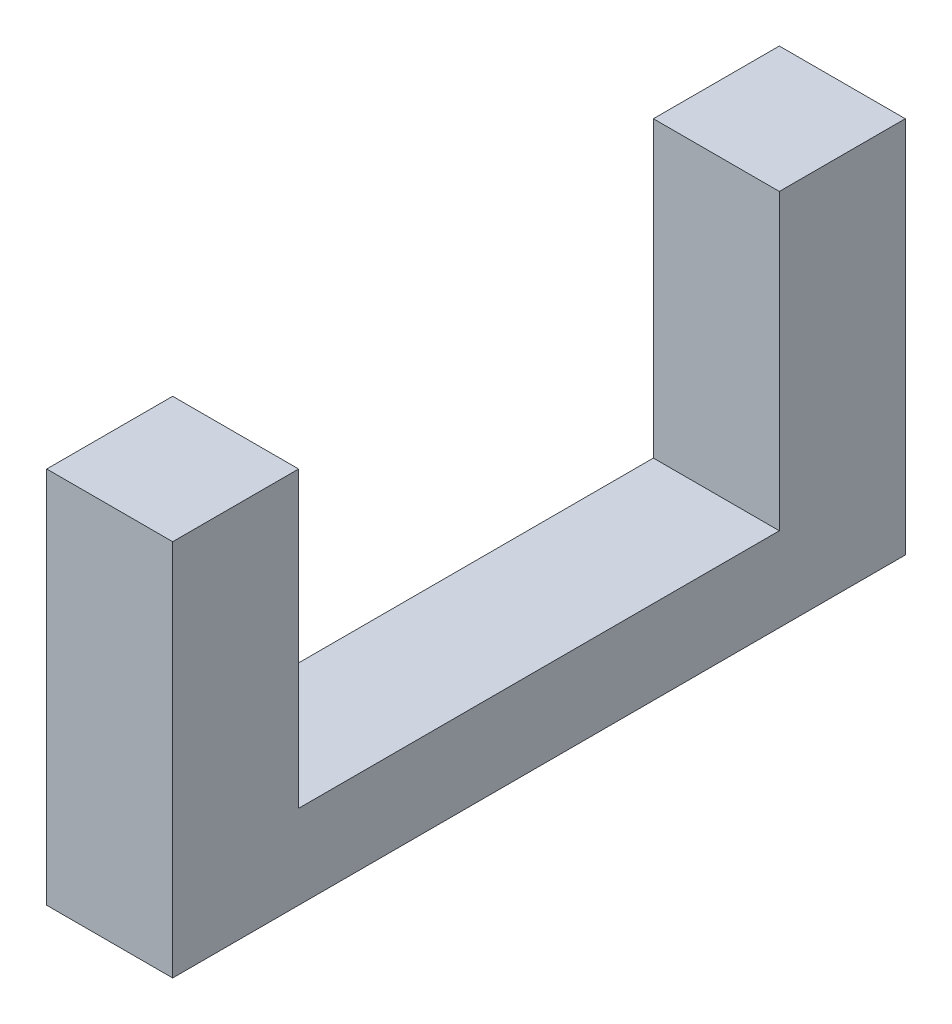
ISO-10303-21;
HEADER;
FILE_DESCRIPTION(('STEP AP214'),'2;1');
FILE_NAME('part.step','',(''),(''),'','','');
FILE_SCHEMA(('AUTOMOTIVE_DESIGN { 1 0 10303 214 1 1 1 1 }'));
ENDSEC;
DATA;
#1=APPLICATION_CONTEXT('core data for automotive mechanical design processes');
#2=APPLICATION_PROTOCOL_DEFINITION('international standard','automotive_design',2000,#1);
#3=PRODUCT_CONTEXT('',#1,'mechanical');
#4=PRODUCT('Part','Part','',(#3));
#5=PRODUCT_RELATED_PRODUCT_CATEGORY('part','',(#4));
#6=PRODUCT_DEFINITION_FORMATION('','',#4);
#7=PRODUCT_DEFINITION_CONTEXT('part definition',#1,'design');
#8=PRODUCT_DEFINITION('design','',#6,#7);
#9=PRODUCT_DEFINITION_SHAPE('','',#8);
#10=(LENGTH_UNIT() NAMED_UNIT(*) SI_UNIT(.MILLI.,.METRE.));
#11=(NAMED_UNIT(*) PLANE_ANGLE_UNIT() SI_UNIT($,.RADIAN.));
#12=(NAMED_UNIT(*) SI_UNIT($,.STERADIAN.) SOLID_ANGLE_UNIT());
#13=UNCERTAINTY_MEASURE_WITH_UNIT(LENGTH_MEASURE(1.E-05),#10,'distance_accuracy_value','');
#14=(GEOMETRIC_REPRESENTATION_CONTEXT(3) GLOBAL_UNCERTAINTY_ASSIGNED_CONTEXT((#13)) GLOBAL_UNIT_ASSIGNED_CONTEXT((#10,
#11,#12)) REPRESENTATION_CONTEXT('',''));
#15=CARTESIAN_POINT('',(0.,0.,0.));
#16=DIRECTION('',(0.,0.,1.));
#17=DIRECTION('',(1.,0.,0.));
#18=AXIS2_PLACEMENT_3D('',#15,#16,#17);
#19=CARTESIAN_POINT('',(-17.65,3.,-7.));
#20=DIRECTION('',(0.,1.,0.));
#21=DIRECTION('',(0.,0.,1.));
#22=AXIS2_PLACEMENT_3D('',#19,#20,#21);
#23=PLANE('',#22);
#24=DIRECTION('',(0.,0.,-1.));
#25=VECTOR('',#24,1.);
#26=CARTESIAN_POINT('',(-16.65,3.,-0.999999999999999));
#27=LINE('',#26,#25);
#28=CARTESIAN_POINT('',(-16.65,3.,33.9));
#29=VERTEX_POINT('',#28);
#30=CARTESIAN_POINT('',(-16.65,3.,-0.999999999999997));
#31=VERTEX_POINT('',#30);
#32=EDGE_CURVE('E154',#29,#31,#27,.T.);
#33=ORIENTED_EDGE('',*,*,#32,.F.);
#34=DIRECTION('',(1.,0.,0.));
#35=VECTOR('',#34,1.);
#36=CARTESIAN_POINT('',(-22.65,3.,33.9));
#37=LINE('',#36,#35);
#38=CARTESIAN_POINT('',(-22.65,3.,33.9));
#39=VERTEX_POINT('',#38);
#40=EDGE_CURVE('E132',#39,#29,#37,.T.);
#41=ORIENTED_EDGE('',*,*,#40,.F.);
#42=DIRECTION('',(0.,0.,1.));
#43=VECTOR('',#42,1.);
#44=CARTESIAN_POINT('',(-22.65,3.,-0.999999999999999));
#45=LINE('',#44,#43);
#46=CARTESIAN_POINT('',(-22.65,3.,-0.999999999999999));
#47=VERTEX_POINT('',#46);
#48=EDGE_CURVE('E58',#47,#39,#45,.T.);
#49=ORIENTED_EDGE('',*,*,#48,.F.);
#50=DIRECTION('',(-1.,0.,0.));
#51=VECTOR('',#50,1.);
#52=CARTESIAN_POINT('',(-22.65,3.,-0.999999999999999));
#53=LINE('',#52,#51);
#54=EDGE_CURVE('E146',#31,#47,#53,.T.);
#55=ORIENTED_EDGE('',*,*,#54,.F.);
#56=EDGE_LOOP('',(#33,#41,#49,#55));
#57=FACE_BOUND('',#56,.T.);
#58=ADVANCED_FACE('F36',(#57),#23,.F.);
#59=CARTESIAN_POINT('',(-22.65,21.,-0.999999999999999));
#60=DIRECTION('',(1.,0.,0.));
#61=DIRECTION('',(0.,0.,-1.));
#62=AXIS2_PLACEMENT_3D('',#59,#60,#61);
#63=PLANE('',#62);
#64=ORIENTED_EDGE('',*,*,#48,.T.);
#65=DIRECTION('',(0.,-1.,0.));
#66=VECTOR('',#65,1.);
#67=CARTESIAN_POINT('',(-22.65,21.,33.9));
#68=LINE('',#67,#66);
#69=CARTESIAN_POINT('',(-22.65,21.,33.9));
#70=VERTEX_POINT('',#69);
#71=EDGE_CURVE('E128',#70,#39,#68,.T.);
#72=ORIENTED_EDGE('',*,*,#71,.F.);
#73=DIRECTION('',(0.,0.,1.));
#74=VECTOR('',#73,1.);
#75=CARTESIAN_POINT('',(-22.65,21.,27.9));
#76=LINE('',#75,#74);
#77=CARTESIAN_POINT('',(-22.65,21.,27.9));
#78=VERTEX_POINT('',#77);
#79=EDGE_CURVE('E134',#78,#70,#76,.T.);
#80=ORIENTED_EDGE('',*,*,#79,.F.);
#81=DIRECTION('',(0.,-1.,0.));
#82=VECTOR('',#81,1.);
#83=CARTESIAN_POINT('',(-22.65,21.,27.9));
#84=LINE('',#83,#82);
#85=CARTESIAN_POINT('',(-22.65,7.,27.9));
#86=VERTEX_POINT('',#85);
#87=EDGE_CURVE('E123',#78,#86,#84,.T.);
#88=ORIENTED_EDGE('',*,*,#87,.T.);
#89=DIRECTION('',(0.,0.,1.));
#90=VECTOR('',#89,1.);
#91=CARTESIAN_POINT('',(-22.65,7.,5.));
#92=LINE('',#91,#90);
#93=CARTESIAN_POINT('',(-22.65,7.,5.));
#94=VERTEX_POINT('',#93);
#95=EDGE_CURVE('E50',#94,#86,#92,.T.);
#96=ORIENTED_EDGE('',*,*,#95,.F.);
#97=DIRECTION('',(0.,-1.,0.));
#98=VECTOR('',#97,1.);
#99=CARTESIAN_POINT('',(-22.65,21.,5.));
#100=LINE('',#99,#98);
#101=CARTESIAN_POINT('',(-22.65,21.,5.));
#102=VERTEX_POINT('',#101);
#103=EDGE_CURVE('E11',#102,#94,#100,.T.);
#104=ORIENTED_EDGE('',*,*,#103,.F.);
#105=DIRECTION('',(0.,0.,1.));
#106=VECTOR('',#105,1.);
#107=CARTESIAN_POINT('',(-22.65,21.,-0.999999999999999));
#108=LINE('',#107,#106);
#109=CARTESIAN_POINT('',(-22.65,21.,-0.999999999999999));
#110=VERTEX_POINT('',#109);
#111=EDGE_CURVE('E142',#110,#102,#108,.T.);
#112=ORIENTED_EDGE('',*,*,#111,.F.);
#113=DIRECTION('',(0.,-1.,0.));
#114=VECTOR('',#113,1.);
#115=CARTESIAN_POINT('',(-22.65,21.,-0.999999999999999));
#116=LINE('',#115,#114);
#117=EDGE_CURVE('E152',#110,#47,#116,.T.);
#118=ORIENTED_EDGE('',*,*,#117,.T.);
#119=EDGE_LOOP('',(#64,#72,#80,#88,#96,#104,#112,#118));
#120=FACE_BOUND('',#119,.T.);
#121=ADVANCED_FACE('F170',(#120),#63,.F.);
#122=CARTESIAN_POINT('',(-22.65,21.,5.));
#123=DIRECTION('',(0.,0.,-1.));
#124=DIRECTION('',(-1.,0.,0.));
#125=AXIS2_PLACEMENT_3D('',#122,#123,#124);
#126=PLANE('',#125);
#127=ORIENTED_EDGE('',*,*,#103,.T.);
#128=DIRECTION('',(-1.,0.,0.));
#129=VECTOR('',#128,1.);
#130=CARTESIAN_POINT('',(-22.65,7.,5.));
#131=LINE('',#130,#129);
#132=CARTESIAN_POINT('',(-16.65,7.,5.));
#133=VERTEX_POINT('',#132);
#134=EDGE_CURVE('E119',#133,#94,#131,.T.);
#135=ORIENTED_EDGE('',*,*,#134,.F.);
#136=DIRECTION('',(0.,-1.,0.));
#137=VECTOR('',#136,1.);
#138=CARTESIAN_POINT('',(-16.65,21.,5.));
#139=LINE('',#138,#137);
#140=CARTESIAN_POINT('',(-16.65,21.,5.));
#141=VERTEX_POINT('',#140);
#142=EDGE_CURVE('E43',#141,#133,#139,.T.);
#143=ORIENTED_EDGE('',*,*,#142,.F.);
#144=DIRECTION('',(1.,0.,0.));
#145=VECTOR('',#144,1.);
#146=CARTESIAN_POINT('',(-22.65,21.,5.));
#147=LINE('',#146,#145);
#148=EDGE_CURVE('E145',#102,#141,#147,.T.);
#149=ORIENTED_EDGE('',*,*,#148,.F.);
#150=EDGE_LOOP('',(#127,#135,#143,#149));
#151=FACE_BOUND('',#150,.T.);
#152=ADVANCED_FACE('F175',(#151),#126,.F.);
#153=CARTESIAN_POINT('',(-16.65,21.,-0.999999999999999));
#154=DIRECTION('',(-1.,0.,0.));
#155=DIRECTION('',(0.,0.,1.));
#156=AXIS2_PLACEMENT_3D('',#153,#154,#155);
#157=PLANE('',#156);
#158=ORIENTED_EDGE('',*,*,#32,.T.);
#159=DIRECTION('',(0.,-1.,0.));
#160=VECTOR('',#159,1.);
#161=CARTESIAN_POINT('',(-16.65,21.,-0.999999999999999));
#162=LINE('',#161,#160);
#163=CARTESIAN_POINT('',(-16.65,21.,-0.999999999999999));
#164=VERTEX_POINT('',#163);
#165=EDGE_CURVE('E158',#164,#31,#162,.T.);
#166=ORIENTED_EDGE('',*,*,#165,.F.);
#167=DIRECTION('',(0.,0.,-1.));
#168=VECTOR('',#167,1.);
#169=CARTESIAN_POINT('',(-16.65,21.,-0.999999999999999));
#170=LINE('',#169,#168);
#171=EDGE_CURVE('E148',#141,#164,#170,.T.);
#172=ORIENTED_EDGE('',*,*,#171,.F.);
#173=ORIENTED_EDGE('',*,*,#142,.T.);
#174=DIRECTION('',(0.,0.,-1.));
#175=VECTOR('',#174,1.);
#176=CARTESIAN_POINT('',(-16.65,7.,5.));
#177=LINE('',#176,#175);
#178=CARTESIAN_POINT('',(-16.65,7.,27.9));
#179=VERTEX_POINT('',#178);
#180=EDGE_CURVE('E102',#179,#133,#177,.T.);
#181=ORIENTED_EDGE('',*,*,#180,.F.);
#182=DIRECTION('',(0.,-1.,0.));
#183=VECTOR('',#182,1.);
#184=CARTESIAN_POINT('',(-16.65,21.,27.9));
#185=LINE('',#184,#183);
#186=CARTESIAN_POINT('',(-16.65,21.,27.9));
#187=VERTEX_POINT('',#186);
#188=EDGE_CURVE('E115',#187,#179,#185,.T.);
#189=ORIENTED_EDGE('',*,*,#188,.F.);
#190=DIRECTION('',(0.,0.,-1.));
#191=VECTOR('',#190,1.);
#192=CARTESIAN_POINT('',(-16.65,21.,27.9));
#193=LINE('',#192,#191);
#194=CARTESIAN_POINT('',(-16.65,21.,33.9));
#195=VERTEX_POINT('',#194);
#196=EDGE_CURVE('E136',#195,#187,#193,.T.);
#197=ORIENTED_EDGE('',*,*,#196,.F.);
#198=DIRECTION('',(0.,-1.,0.));
#199=VECTOR('',#198,1.);
#200=CARTESIAN_POINT('',(-16.65,21.,33.9));
#201=LINE('',#200,#199);
#202=EDGE_CURVE('E124',#195,#29,#201,.T.);
#203=ORIENTED_EDGE('',*,*,#202,.T.);
#204=EDGE_LOOP('',(#158,#166,#172,#173,#181,#189,#197,#203));
#205=FACE_BOUND('',#204,.T.);
#206=ADVANCED_FACE('F113',(#205),#157,.F.);
#207=CARTESIAN_POINT('',(-22.65,21.,-0.999999999999999));
#208=DIRECTION('',(0.,0.,1.));
#209=DIRECTION('',(1.,0.,0.));
#210=AXIS2_PLACEMENT_3D('',#207,#208,#209);
#211=PLANE('',#210);
#212=ORIENTED_EDGE('',*,*,#54,.T.);
#213=ORIENTED_EDGE('',*,*,#117,.F.);
#214=DIRECTION('',(-1.,0.,0.));
#215=VECTOR('',#214,1.);
#216=CARTESIAN_POINT('',(-22.65,21.,-0.999999999999999));
#217=LINE('',#216,#215);
#218=EDGE_CURVE('E150',#164,#110,#217,.T.);
#219=ORIENTED_EDGE('',*,*,#218,.F.);
#220=ORIENTED_EDGE('',*,*,#165,.T.);
#221=EDGE_LOOP('',(#212,#213,#219,#220));
#222=FACE_BOUND('',#221,.T.);
#223=ADVANCED_FACE('F163',(#222),#211,.F.);
#224=CARTESIAN_POINT('',(0.,21.,0.));
#225=DIRECTION('',(0.,1.,0.));
#226=DIRECTION('',(0.,0.,1.));
#227=AXIS2_PLACEMENT_3D('',#224,#225,#226);
#228=PLANE('',#227);
#229=ORIENTED_EDGE('',*,*,#111,.T.);
#230=ORIENTED_EDGE('',*,*,#148,.T.);
#231=ORIENTED_EDGE('',*,*,#171,.T.);
#232=ORIENTED_EDGE('',*,*,#218,.T.);
#233=EDGE_LOOP('',(#229,#230,#231,#232));
#234=FACE_BOUND('',#233,.T.);
#235=ADVANCED_FACE('F173',(#234),#228,.T.);
#236=CARTESIAN_POINT('',(-22.65,21.,33.9));
#237=DIRECTION('',(0.,0.,-1.));
#238=DIRECTION('',(-1.,0.,0.));
#239=AXIS2_PLACEMENT_3D('',#236,#237,#238);
#240=PLANE('',#239);
#241=ORIENTED_EDGE('',*,*,#40,.T.);
#242=ORIENTED_EDGE('',*,*,#202,.F.);
#243=DIRECTION('',(1.,0.,0.));
#244=VECTOR('',#243,1.);
#245=CARTESIAN_POINT('',(-22.65,21.,33.9));
#246=LINE('',#245,#244);
#247=EDGE_CURVE('E138',#70,#195,#246,.T.);
#248=ORIENTED_EDGE('',*,*,#247,.F.);
#249=ORIENTED_EDGE('',*,*,#71,.T.);
#250=EDGE_LOOP('',(#241,#242,#248,#249));
#251=FACE_BOUND('',#250,.T.);
#252=ADVANCED_FACE('F179',(#251),#240,.F.);
#253=CARTESIAN_POINT('',(-22.65,21.,27.9));
#254=DIRECTION('',(0.,0.,1.));
#255=DIRECTION('',(1.,0.,0.));
#256=AXIS2_PLACEMENT_3D('',#253,#254,#255);
#257=PLANE('',#256);
#258=ORIENTED_EDGE('',*,*,#188,.T.);
#259=DIRECTION('',(1.,0.,0.));
#260=VECTOR('',#259,1.);
#261=CARTESIAN_POINT('',(-22.65,7.,27.9));
#262=LINE('',#261,#260);
#263=EDGE_CURVE('E99',#86,#179,#262,.T.);
#264=ORIENTED_EDGE('',*,*,#263,.F.);
#265=ORIENTED_EDGE('',*,*,#87,.F.);
#266=DIRECTION('',(-1.,0.,0.));
#267=VECTOR('',#266,1.);
#268=CARTESIAN_POINT('',(-22.65,21.,27.9));
#269=LINE('',#268,#267);
#270=EDGE_CURVE('E122',#187,#78,#269,.T.);
#271=ORIENTED_EDGE('',*,*,#270,.F.);
#272=EDGE_LOOP('',(#258,#264,#265,#271));
#273=FACE_BOUND('',#272,.T.);
#274=ADVANCED_FACE('F121',(#273),#257,.F.);
#275=CARTESIAN_POINT('',(0.,21.,0.));
#276=DIRECTION('',(0.,1.,0.));
#277=DIRECTION('',(0.,0.,1.));
#278=AXIS2_PLACEMENT_3D('',#275,#276,#277);
#279=PLANE('',#278);
#280=ORIENTED_EDGE('',*,*,#79,.T.);
#281=ORIENTED_EDGE('',*,*,#247,.T.);
#282=ORIENTED_EDGE('',*,*,#196,.T.);
#283=ORIENTED_EDGE('',*,*,#270,.T.);
#284=EDGE_LOOP('',(#280,#281,#282,#283));
#285=FACE_BOUND('',#284,.T.);
#286=ADVANCED_FACE('F182',(#285),#279,.T.);
#287=CARTESIAN_POINT('',(0.,7.,0.));
#288=DIRECTION('',(0.,1.,0.));
#289=DIRECTION('',(0.,0.,1.));
#290=AXIS2_PLACEMENT_3D('',#287,#288,#289);
#291=PLANE('',#290);
#292=ORIENTED_EDGE('',*,*,#95,.T.);
#293=ORIENTED_EDGE('',*,*,#263,.T.);
#294=ORIENTED_EDGE('',*,*,#180,.T.);
#295=ORIENTED_EDGE('',*,*,#134,.T.);
#296=EDGE_LOOP('',(#292,#293,#294,#295));
#297=FACE_BOUND('',#296,.T.);
#298=ADVANCED_FACE('F101',(#297),#291,.T.);
#299=CLOSED_SHELL('',(#58,#121,#152,#206,#223,#235,#252,#274,#286,#298));
#300=MANIFOLD_SOLID_BREP('B2',#299);
#301=ADVANCED_BREP_SHAPE_REPRESENTATION('',(#18,#300),#14);
#302=SHAPE_DEFINITION_REPRESENTATION(#9,#301);
ENDSEC;
END-ISO-10303-21;
